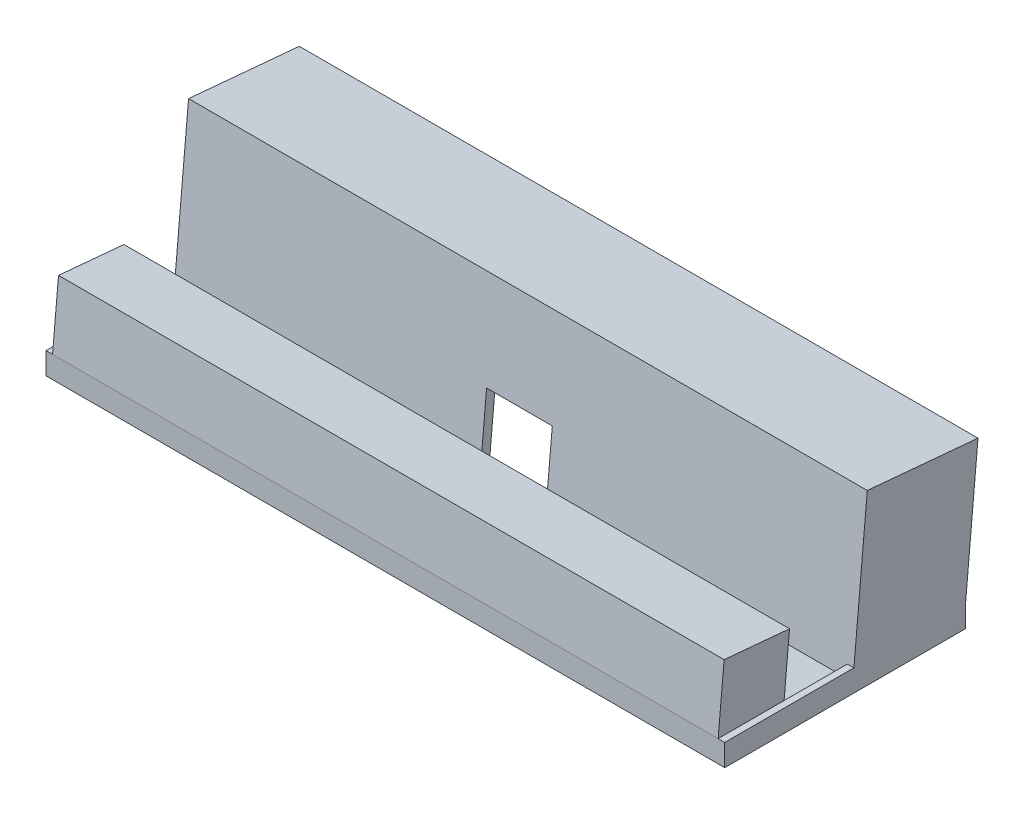
ISO-10303-21;
HEADER;
FILE_DESCRIPTION(('STEP AP214'),'2;1');
FILE_NAME('part.step','',(''),(''),'','','');
FILE_SCHEMA(('AUTOMOTIVE_DESIGN { 1 0 10303 214 1 1 1 1 }'));
ENDSEC;
DATA;
#1=APPLICATION_CONTEXT('core data for automotive mechanical design processes');
#2=APPLICATION_PROTOCOL_DEFINITION('international standard','automotive_design',2000,#1);
#3=PRODUCT_CONTEXT('',#1,'mechanical');
#4=PRODUCT('Part','Part','',(#3));
#5=PRODUCT_RELATED_PRODUCT_CATEGORY('part','',(#4));
#6=PRODUCT_DEFINITION_FORMATION('','',#4);
#7=PRODUCT_DEFINITION_CONTEXT('part definition',#1,'design');
#8=PRODUCT_DEFINITION('design','',#6,#7);
#9=PRODUCT_DEFINITION_SHAPE('','',#8);
#10=(LENGTH_UNIT() NAMED_UNIT(*) SI_UNIT(.MILLI.,.METRE.));
#11=(NAMED_UNIT(*) PLANE_ANGLE_UNIT() SI_UNIT($,.RADIAN.));
#12=(NAMED_UNIT(*) SI_UNIT($,.STERADIAN.) SOLID_ANGLE_UNIT());
#13=UNCERTAINTY_MEASURE_WITH_UNIT(LENGTH_MEASURE(1.E-05),#10,'distance_accuracy_value','');
#14=(GEOMETRIC_REPRESENTATION_CONTEXT(3) GLOBAL_UNCERTAINTY_ASSIGNED_CONTEXT((#13)) GLOBAL_UNIT_ASSIGNED_CONTEXT((#10,
#11,#12)) REPRESENTATION_CONTEXT('',''));
#15=CARTESIAN_POINT('',(0.,0.,0.));
#16=DIRECTION('',(0.,0.,1.));
#17=DIRECTION('',(1.,0.,0.));
#18=AXIS2_PLACEMENT_3D('',#15,#16,#17);
#19=CARTESIAN_POINT('',(0.,5.,0.));
#20=DIRECTION('',(0.,1.,0.));
#21=DIRECTION('',(0.,0.,1.));
#22=AXIS2_PLACEMENT_3D('',#19,#20,#21);
#23=PLANE('',#22);
#24=DIRECTION('',(0.,0.,-1.));
#25=VECTOR('',#24,1.);
#26=CARTESIAN_POINT('',(76.,5.,0.));
#27=LINE('',#26,#25);
#28=CARTESIAN_POINT('',(76.,5.,27.5));
#29=VERTEX_POINT('',#28);
#30=CARTESIAN_POINT('',(76.,5.,12.4381440674719));
#31=VERTEX_POINT('',#30);
#32=EDGE_CURVE('E281',#29,#31,#27,.T.);
#33=ORIENTED_EDGE('',*,*,#32,.F.);
#34=DIRECTION('',(1.,0.,0.));
#35=VECTOR('',#34,1.);
#36=CARTESIAN_POINT('',(-77.5,5.,27.5));
#37=LINE('',#36,#35);
#38=CARTESIAN_POINT('',(77.5,5.,27.5));
#39=VERTEX_POINT('',#38);
#40=EDGE_CURVE('E412',#29,#39,#37,.T.);
#41=ORIENTED_EDGE('',*,*,#40,.T.);
#42=DIRECTION('',(0.,0.,-1.));
#43=VECTOR('',#42,1.);
#44=CARTESIAN_POINT('',(77.5,5.,-27.5));
#45=LINE('',#44,#43);
#46=CARTESIAN_POINT('',(77.5,5.,-2.00396558579183));
#47=VERTEX_POINT('',#46);
#48=EDGE_CURVE('E404',#39,#47,#45,.T.);
#49=ORIENTED_EDGE('',*,*,#48,.T.);
#50=DIRECTION('',(-1.,0.,0.));
#51=VECTOR('',#50,1.);
#52=CARTESIAN_POINT('',(0.,5.,-2.00396558579184));
#53=LINE('',#52,#51);
#54=CARTESIAN_POINT('',(76.,5.,-2.00396558579183));
#55=VERTEX_POINT('',#54);
#56=EDGE_CURVE('E380',#47,#55,#53,.T.);
#57=ORIENTED_EDGE('',*,*,#56,.T.);
#58=DIRECTION('',(0.,0.,1.));
#59=VECTOR('',#58,1.);
#60=CARTESIAN_POINT('',(76.,5.,0.));
#61=LINE('',#60,#59);
#62=EDGE_CURVE('E11',#55,#31,#61,.T.);
#63=ORIENTED_EDGE('',*,*,#62,.T.);
#64=EDGE_LOOP('',(#33,#41,#49,#57,#63));
#65=FACE_BOUND('',#64,.T.);
#66=ADVANCED_FACE('F35',(#65),#23,.T.);
#67=DIRECTION('',(0.,0.,1.));
#68=VECTOR('',#67,1.);
#69=CARTESIAN_POINT('',(-76.,5.,0.));
#70=LINE('',#69,#68);
#71=CARTESIAN_POINT('',(-76.,5.,12.4381440674719));
#72=VERTEX_POINT('',#71);
#73=CARTESIAN_POINT('',(-76.,5.,27.5));
#74=VERTEX_POINT('',#73);
#75=EDGE_CURVE('E276',#72,#74,#70,.T.);
#76=ORIENTED_EDGE('',*,*,#75,.F.);
#77=DIRECTION('',(0.,0.,-1.));
#78=VECTOR('',#77,1.);
#79=CARTESIAN_POINT('',(-76.,5.,0.));
#80=LINE('',#79,#78);
#81=CARTESIAN_POINT('',(-76.,5.,-2.00396558579183));
#82=VERTEX_POINT('',#81);
#83=EDGE_CURVE('E43',#72,#82,#80,.T.);
#84=ORIENTED_EDGE('',*,*,#83,.T.);
#85=CARTESIAN_POINT('',(-77.5,5.,-2.00396558579183));
#86=VERTEX_POINT('',#85);
#87=EDGE_CURVE('E376',#82,#86,#53,.T.);
#88=ORIENTED_EDGE('',*,*,#87,.T.);
#89=DIRECTION('',(0.,0.,1.));
#90=VECTOR('',#89,1.);
#91=CARTESIAN_POINT('',(-77.5,5.,-27.5));
#92=LINE('',#91,#90);
#93=CARTESIAN_POINT('',(-77.5,5.,27.5));
#94=VERTEX_POINT('',#93);
#95=EDGE_CURVE('E410',#86,#94,#92,.T.);
#96=ORIENTED_EDGE('',*,*,#95,.T.);
#97=EDGE_CURVE('E413',#94,#74,#37,.T.);
#98=ORIENTED_EDGE('',*,*,#97,.T.);
#99=EDGE_LOOP('',(#76,#84,#88,#96,#98));
#100=FACE_BOUND('',#99,.T.);
#101=ADVANCED_FACE('F438',(#100),#23,.T.);
#102=CARTESIAN_POINT('',(77.5,5.,-27.5));
#103=DIRECTION('',(-1.,0.,0.));
#104=DIRECTION('',(0.,0.,1.));
#105=AXIS2_PLACEMENT_3D('',#102,#103,#104);
#106=PLANE('',#105);
#107=DIRECTION('',(0.,-1.,0.));
#108=VECTOR('',#107,1.);
#109=CARTESIAN_POINT('',(77.5,5.,-27.5));
#110=LINE('',#109,#108);
#111=CARTESIAN_POINT('',(77.5,5.,-27.5));
#112=VERTEX_POINT('',#111);
#113=CARTESIAN_POINT('',(77.5,0.,-27.5));
#114=VERTEX_POINT('',#113);
#115=EDGE_CURVE('E432',#112,#114,#110,.T.);
#116=ORIENTED_EDGE('',*,*,#115,.F.);
#117=DIRECTION('',(0.,0.995893206467704,-0.0905357460425185));
#118=VECTOR('',#117,1.);
#119=CARTESIAN_POINT('',(77.5,1.39901979719515,-27.1726381633814));
#120=LINE('',#119,#118);
#121=CARTESIAN_POINT('',(77.5,36.2552820235648,-30.3413892748695));
#122=VERTEX_POINT('',#121);
#123=EDGE_CURVE('E361',#112,#122,#120,.T.);
#124=ORIENTED_EDGE('',*,*,#123,.T.);
#125=DIRECTION('',(0.,0.0905357460425186,0.995893206467704));
#126=VECTOR('',#125,1.);
#127=CARTESIAN_POINT('',(77.5,36.2552820235648,-30.3413892748695));
#128=LINE('',#127,#126);
#129=CARTESIAN_POINT('',(77.5,38.5541047986164,-5.05433874930241));
#130=VERTEX_POINT('',#129);
#131=EDGE_CURVE('E367',#122,#130,#128,.T.);
#132=ORIENTED_EDGE('',*,*,#131,.T.);
#133=DIRECTION('',(0.,0.995893206467704,-0.0905357460425185));
#134=VECTOR('',#133,1.);
#135=CARTESIAN_POINT('',(77.5,3.69784257224671,-1.88558763781426));
#136=LINE('',#135,#134);
#137=EDGE_CURVE('E370',#47,#130,#136,.T.);
#138=ORIENTED_EDGE('',*,*,#137,.F.);
#139=ORIENTED_EDGE('',*,*,#48,.F.);
#140=DIRECTION('',(0.,-1.,0.));
#141=VECTOR('',#140,1.);
#142=CARTESIAN_POINT('',(77.5,5.,27.5));
#143=LINE('',#142,#141);
#144=CARTESIAN_POINT('',(77.5,0.,27.5));
#145=VERTEX_POINT('',#144);
#146=EDGE_CURVE('E416',#39,#145,#143,.T.);
#147=ORIENTED_EDGE('',*,*,#146,.T.);
#148=DIRECTION('',(0.,0.,-1.));
#149=VECTOR('',#148,1.);
#150=CARTESIAN_POINT('',(77.5,0.,-27.5));
#151=LINE('',#150,#149);
#152=EDGE_CURVE('E403',#145,#114,#151,.T.);
#153=ORIENTED_EDGE('',*,*,#152,.T.);
#154=EDGE_LOOP('',(#116,#124,#132,#138,#139,#147,#153));
#155=FACE_BOUND('',#154,.T.);
#156=ADVANCED_FACE('F37',(#155),#106,.F.);
#157=CARTESIAN_POINT('',(-77.5,5.,-27.5));
#158=DIRECTION('',(0.,0.,1.));
#159=DIRECTION('',(1.,0.,0.));
#160=AXIS2_PLACEMENT_3D('',#157,#158,#159);
#161=PLANE('',#160);
#162=DIRECTION('',(-1.,0.,0.));
#163=VECTOR('',#162,1.);
#164=CARTESIAN_POINT('',(-77.5,0.,-27.5));
#165=LINE('',#164,#163);
#166=CARTESIAN_POINT('',(-77.5,0.,-27.5));
#167=VERTEX_POINT('',#166);
#168=EDGE_CURVE('E419',#114,#167,#165,.T.);
#169=ORIENTED_EDGE('',*,*,#168,.T.);
#170=DIRECTION('',(0.,-1.,0.));
#171=VECTOR('',#170,1.);
#172=CARTESIAN_POINT('',(-77.5,5.,-27.5));
#173=LINE('',#172,#171);
#174=CARTESIAN_POINT('',(-77.5,5.,-27.5));
#175=VERTEX_POINT('',#174);
#176=EDGE_CURVE('E429',#175,#167,#173,.T.);
#177=ORIENTED_EDGE('',*,*,#176,.F.);
#178=DIRECTION('',(-1.,0.,0.));
#179=VECTOR('',#178,1.);
#180=CARTESIAN_POINT('',(-77.5,5.,-27.5));
#181=LINE('',#180,#179);
#182=EDGE_CURVE('E406',#112,#175,#181,.T.);
#183=ORIENTED_EDGE('',*,*,#182,.F.);
#184=ORIENTED_EDGE('',*,*,#115,.T.);
#185=EDGE_LOOP('',(#169,#177,#183,#184));
#186=FACE_BOUND('',#185,.T.);
#187=ADVANCED_FACE('F500',(#186),#161,.F.);
#188=CARTESIAN_POINT('',(-77.5,5.,-27.5));
#189=DIRECTION('',(1.,0.,0.));
#190=DIRECTION('',(0.,0.,-1.));
#191=AXIS2_PLACEMENT_3D('',#188,#189,#190);
#192=PLANE('',#191);
#193=CARTESIAN_POINT('',(-77.5,25.5,-13.4067773733626));
#194=DIRECTION('',(-1.,0.,0.));
#195=DIRECTION('',(0.,0.,1.));
#196=AXIS2_PLACEMENT_3D('',#193,#194,#195);
#197=CIRCLE('',#196,7.5);
#198=CARTESIAN_POINT('',(-77.5,25.5,-5.90677737336265));
#199=VERTEX_POINT('',#198);
#200=EDGE_CURVE('E858',#199,#199,#197,.T.);
#201=ORIENTED_EDGE('',*,*,#200,.F.);
#202=EDGE_LOOP('',(#201));
#203=FACE_BOUND('',#202,.T.);
#204=ORIENTED_EDGE('',*,*,#95,.F.);
#205=DIRECTION('',(0.,-0.995893206467704,0.0905357460425185));
#206=VECTOR('',#205,1.);
#207=CARTESIAN_POINT('',(-77.5,3.69784257224671,-1.88558763781426));
#208=LINE('',#207,#206);
#209=CARTESIAN_POINT('',(-77.5,38.5541047986164,-5.05433874930241));
#210=VERTEX_POINT('',#209);
#211=EDGE_CURVE('E357',#210,#86,#208,.T.);
#212=ORIENTED_EDGE('',*,*,#211,.F.);
#213=DIRECTION('',(0.,0.0905357460425186,0.995893206467704));
#214=VECTOR('',#213,1.);
#215=CARTESIAN_POINT('',(-77.5,36.2552820235648,-30.3413892748695));
#216=LINE('',#215,#214);
#217=CARTESIAN_POINT('',(-77.5,36.2552820235648,-30.3413892748695));
#218=VERTEX_POINT('',#217);
#219=EDGE_CURVE('E374',#218,#210,#216,.T.);
#220=ORIENTED_EDGE('',*,*,#219,.F.);
#221=DIRECTION('',(0.,-0.995893206467704,0.0905357460425185));
#222=VECTOR('',#221,1.);
#223=CARTESIAN_POINT('',(-77.5,1.39901979719515,-27.1726381633814));
#224=LINE('',#223,#222);
#225=EDGE_CURVE('E358',#218,#175,#224,.T.);
#226=ORIENTED_EDGE('',*,*,#225,.T.);
#227=ORIENTED_EDGE('',*,*,#176,.T.);
#228=DIRECTION('',(0.,0.,1.));
#229=VECTOR('',#228,1.);
#230=CARTESIAN_POINT('',(-77.5,0.,-27.5));
#231=LINE('',#230,#229);
#232=CARTESIAN_POINT('',(-77.5,0.,27.5));
#233=VERTEX_POINT('',#232);
#234=EDGE_CURVE('E421',#167,#233,#231,.T.);
#235=ORIENTED_EDGE('',*,*,#234,.T.);
#236=DIRECTION('',(0.,-1.,0.));
#237=VECTOR('',#236,1.);
#238=CARTESIAN_POINT('',(-77.5,5.,27.5));
#239=LINE('',#238,#237);
#240=EDGE_CURVE('E426',#94,#233,#239,.T.);
#241=ORIENTED_EDGE('',*,*,#240,.F.);
#242=EDGE_LOOP('',(#204,#212,#220,#226,#227,#235,#241));
#243=FACE_BOUND('',#242,.T.);
#244=ADVANCED_FACE('F450',(#203,#243),#192,.F.);
#245=CARTESIAN_POINT('',(-77.5,5.,27.5));
#246=DIRECTION('',(0.,0.,-1.));
#247=DIRECTION('',(-1.,0.,0.));
#248=AXIS2_PLACEMENT_3D('',#245,#246,#247);
#249=PLANE('',#248);
#250=DIRECTION('',(1.,0.,0.));
#251=VECTOR('',#250,1.);
#252=CARTESIAN_POINT('',(-77.5,0.,27.5));
#253=LINE('',#252,#251);
#254=EDGE_CURVE('E407',#233,#145,#253,.T.);
#255=ORIENTED_EDGE('',*,*,#254,.T.);
#256=ORIENTED_EDGE('',*,*,#146,.F.);
#257=ORIENTED_EDGE('',*,*,#40,.F.);
#258=DIRECTION('',(-1.,0.,0.));
#259=VECTOR('',#258,1.);
#260=CARTESIAN_POINT('',(76.,5.,27.5));
#261=LINE('',#260,#259);
#262=EDGE_CURVE('E258',#29,#74,#261,.T.);
#263=ORIENTED_EDGE('',*,*,#262,.T.);
#264=ORIENTED_EDGE('',*,*,#97,.F.);
#265=ORIENTED_EDGE('',*,*,#240,.T.);
#266=EDGE_LOOP('',(#255,#256,#257,#263,#264,#265));
#267=FACE_BOUND('',#266,.T.);
#268=ADVANCED_FACE('F499',(#267),#249,.F.);
#269=CARTESIAN_POINT('',(0.,0.,0.));
#270=DIRECTION('',(0.,1.,0.));
#271=DIRECTION('',(0.,0.,1.));
#272=AXIS2_PLACEMENT_3D('',#269,#270,#271);
#273=PLANE('',#272);
#274=DIRECTION('',(1.,0.,0.));
#275=VECTOR('',#274,1.);
#276=CARTESIAN_POINT('',(-77.5,0.,25.5));
#277=LINE('',#276,#275);
#278=CARTESIAN_POINT('',(-75.5,0.,25.5));
#279=VERTEX_POINT('',#278);
#280=CARTESIAN_POINT('',(75.5,0.,25.5));
#281=VERTEX_POINT('',#280);
#282=EDGE_CURVE('E289',#279,#281,#277,.T.);
#283=ORIENTED_EDGE('',*,*,#282,.T.);
#284=DIRECTION('',(0.,0.,-1.));
#285=VECTOR('',#284,1.);
#286=CARTESIAN_POINT('',(75.5,0.,-27.5));
#287=LINE('',#286,#285);
#288=CARTESIAN_POINT('',(75.5,0.,-25.5));
#289=VERTEX_POINT('',#288);
#290=EDGE_CURVE('E335',#281,#289,#287,.T.);
#291=ORIENTED_EDGE('',*,*,#290,.T.);
#292=DIRECTION('',(-1.,0.,0.));
#293=VECTOR('',#292,1.);
#294=CARTESIAN_POINT('',(-77.5,0.,-25.5));
#295=LINE('',#294,#293);
#296=CARTESIAN_POINT('',(-75.5,0.,-25.5));
#297=VERTEX_POINT('',#296);
#298=EDGE_CURVE('E340',#289,#297,#295,.T.);
#299=ORIENTED_EDGE('',*,*,#298,.T.);
#300=DIRECTION('',(0.,0.,1.));
#301=VECTOR('',#300,1.);
#302=CARTESIAN_POINT('',(-75.5,0.,-27.5));
#303=LINE('',#302,#301);
#304=EDGE_CURVE('E343',#297,#279,#303,.T.);
#305=ORIENTED_EDGE('',*,*,#304,.T.);
#306=EDGE_LOOP('',(#283,#291,#299,#305));
#307=FACE_BOUND('',#306,.T.);
#308=ORIENTED_EDGE('',*,*,#152,.F.);
#309=ORIENTED_EDGE('',*,*,#254,.F.);
#310=ORIENTED_EDGE('',*,*,#234,.F.);
#311=ORIENTED_EDGE('',*,*,#168,.F.);
#312=EDGE_LOOP('',(#308,#309,#310,#311));
#313=FACE_BOUND('',#312,.T.);
#314=ADVANCED_FACE('F497',(#307,#313),#273,.F.);
#315=CARTESIAN_POINT('',(76.,8.62142984170074,12.1089231727719));
#316=DIRECTION('',(-1.,0.,0.));
#317=DIRECTION('',(0.,0.,1.));
#318=AXIS2_PLACEMENT_3D('',#315,#316,#317);
#319=PLANE('',#318);
#320=DIRECTION('',(0.,-0.995893206467704,0.0905357460425185));
#321=VECTOR('',#320,1.);
#322=CARTESIAN_POINT('',(76.,7.31927241394745,-2.21480853251433));
#323=LINE('',#322,#321);
#324=CARTESIAN_POINT('',(76.,2.33980638160893,-1.76212980230174));
#325=VERTEX_POINT('',#324);
#326=EDGE_CURVE('E401',#55,#325,#323,.T.);
#327=ORIENTED_EDGE('',*,*,#326,.T.);
#328=DIRECTION('',(0.,-0.0905357460425185,-0.995893206467704));
#329=VECTOR('',#328,1.);
#330=CARTESIAN_POINT('',(76.,3.64196380936222,12.5616019029845));
#331=LINE('',#330,#329);
#332=CARTESIAN_POINT('',(76.,3.64196380936222,12.5616019029845));
#333=VERTEX_POINT('',#332);
#334=EDGE_CURVE('E381',#333,#325,#331,.T.);
#335=ORIENTED_EDGE('',*,*,#334,.F.);
#336=DIRECTION('',(0.,-0.995893206467704,0.0905357460425185));
#337=VECTOR('',#336,1.);
#338=CARTESIAN_POINT('',(76.,8.62142984170074,12.1089231727719));
#339=LINE('',#338,#337);
#340=EDGE_CURVE('E394',#31,#333,#339,.T.);
#341=ORIENTED_EDGE('',*,*,#340,.F.);
#342=ORIENTED_EDGE('',*,*,#62,.F.);
#343=EDGE_LOOP('',(#327,#335,#341,#342));
#344=FACE_BOUND('',#343,.T.);
#345=ADVANCED_FACE('F477',(#344),#319,.T.);
#346=CARTESIAN_POINT('',(-76.,7.31927241394745,-2.21480853251433));
#347=DIRECTION('',(0.,0.0905357460425185,0.995893206467704));
#348=DIRECTION('',(0.,-0.995893206467704,0.0905357460425185));
#349=AXIS2_PLACEMENT_3D('',#346,#347,#348);
#350=PLANE('',#349);
#351=DIRECTION('',(0.,0.995893206467704,-0.0905357460425185));
#352=VECTOR('',#351,1.);
#353=CARTESIAN_POINT('',(7.5,17.2782044786245,-3.12016599293952));
#354=LINE('',#353,#352);
#355=CARTESIAN_POINT('',(7.5,2.33980638160893,-1.76212980230174));
#356=VERTEX_POINT('',#355);
#357=CARTESIAN_POINT('',(7.5,17.2782044786245,-3.12016599293952));
#358=VERTEX_POINT('',#357);
#359=EDGE_CURVE('E223',#356,#358,#354,.T.);
#360=ORIENTED_EDGE('',*,*,#359,.F.);
#361=DIRECTION('',(-1.,0.,0.));
#362=VECTOR('',#361,1.);
#363=CARTESIAN_POINT('',(-76.,2.33980638160893,-1.76212980230174));
#364=LINE('',#363,#362);
#365=EDGE_CURVE('E385',#325,#356,#364,.T.);
#366=ORIENTED_EDGE('',*,*,#365,.F.);
#367=ORIENTED_EDGE('',*,*,#326,.F.);
#368=ORIENTED_EDGE('',*,*,#56,.F.);
#369=ORIENTED_EDGE('',*,*,#137,.T.);
#370=DIRECTION('',(-1.,0.,0.));
#371=VECTOR('',#370,1.);
#372=CARTESIAN_POINT('',(-77.5,38.5541047986164,-5.05433874930241));
#373=LINE('',#372,#371);
#374=EDGE_CURVE('E362',#130,#210,#373,.T.);
#375=ORIENTED_EDGE('',*,*,#374,.T.);
#376=ORIENTED_EDGE('',*,*,#211,.T.);
#377=ORIENTED_EDGE('',*,*,#87,.F.);
#378=DIRECTION('',(0.,-0.995893206467704,0.0905357460425185));
#379=VECTOR('',#378,1.);
#380=CARTESIAN_POINT('',(-76.,7.31927241394745,-2.21480853251433));
#381=LINE('',#380,#379);
#382=CARTESIAN_POINT('',(-76.,2.33980638160893,-1.76212980230174));
#383=VERTEX_POINT('',#382);
#384=EDGE_CURVE('E398',#82,#383,#381,.T.);
#385=ORIENTED_EDGE('',*,*,#384,.T.);
#386=CARTESIAN_POINT('',(-7.49999999999999,2.33980638160893,-1.76212980230174));
#387=VERTEX_POINT('',#386);
#388=EDGE_CURVE('E384',#387,#383,#364,.T.);
#389=ORIENTED_EDGE('',*,*,#388,.F.);
#390=DIRECTION('',(0.,-0.995893206467704,0.0905357460425185));
#391=VECTOR('',#390,1.);
#392=CARTESIAN_POINT('',(-7.5,17.2782044786245,-3.12016599293952));
#393=LINE('',#392,#391);
#394=CARTESIAN_POINT('',(-7.5,17.2782044786245,-3.12016599293952));
#395=VERTEX_POINT('',#394);
#396=EDGE_CURVE('E55',#395,#387,#393,.T.);
#397=ORIENTED_EDGE('',*,*,#396,.F.);
#398=DIRECTION('',(-1.,0.,0.));
#399=VECTOR('',#398,1.);
#400=CARTESIAN_POINT('',(-7.5,17.2782044786245,-3.12016599293952));
#401=LINE('',#400,#399);
#402=EDGE_CURVE('E243',#358,#395,#401,.T.);
#403=ORIENTED_EDGE('',*,*,#402,.F.);
#404=EDGE_LOOP('',(#360,#366,#367,#368,#369,#375,#376,#377,#385,#389,#397,#403));
#405=FACE_BOUND('',#404,.T.);
#406=ADVANCED_FACE('F444',(#405),#350,.T.);
#407=CARTESIAN_POINT('',(-76.,8.62142984170074,12.1089231727719));
#408=DIRECTION('',(1.,0.,0.));
#409=DIRECTION('',(0.,0.,-1.));
#410=AXIS2_PLACEMENT_3D('',#407,#408,#409);
#411=PLANE('',#410);
#412=DIRECTION('',(0.,-0.995893206467704,0.0905357460425185));
#413=VECTOR('',#412,1.);
#414=CARTESIAN_POINT('',(-76.,8.62142984170074,12.1089231727719));
#415=LINE('',#414,#413);
#416=CARTESIAN_POINT('',(-76.,3.64196380936222,12.5616019029845));
#417=VERTEX_POINT('',#416);
#418=EDGE_CURVE('E396',#72,#417,#415,.T.);
#419=ORIENTED_EDGE('',*,*,#418,.T.);
#420=DIRECTION('',(0.,0.0905357460425185,0.995893206467704));
#421=VECTOR('',#420,1.);
#422=CARTESIAN_POINT('',(-76.,3.64196380936222,12.5616019029845));
#423=LINE('',#422,#421);
#424=EDGE_CURVE('E388',#383,#417,#423,.T.);
#425=ORIENTED_EDGE('',*,*,#424,.F.);
#426=ORIENTED_EDGE('',*,*,#384,.F.);
#427=ORIENTED_EDGE('',*,*,#83,.F.);
#428=EDGE_LOOP('',(#419,#425,#426,#427));
#429=FACE_BOUND('',#428,.T.);
#430=ADVANCED_FACE('F470',(#429),#411,.T.);
#431=CARTESIAN_POINT('',(-76.,8.62142984170074,12.1089231727719));
#432=DIRECTION('',(0.,-0.0905357460425185,-0.995893206467704));
#433=DIRECTION('',(0.,0.995893206467704,-0.0905357460425185));
#434=AXIS2_PLACEMENT_3D('',#431,#432,#433);
#435=PLANE('',#434);
#436=ORIENTED_EDGE('',*,*,#340,.T.);
#437=DIRECTION('',(1.,0.,0.));
#438=VECTOR('',#437,1.);
#439=CARTESIAN_POINT('',(-76.,3.64196380936222,12.5616019029845));
#440=LINE('',#439,#438);
#441=EDGE_CURVE('E391',#417,#333,#440,.T.);
#442=ORIENTED_EDGE('',*,*,#441,.F.);
#443=ORIENTED_EDGE('',*,*,#418,.F.);
#444=DIRECTION('',(0.,0.995893206467704,-0.0905357460425185));
#445=VECTOR('',#444,1.);
#446=CARTESIAN_POINT('',(-76.,3.64196380936222,12.5616019029845));
#447=LINE('',#446,#445);
#448=CARTESIAN_POINT('',(-76.,18.5803619063778,11.2035657123467));
#449=VERTEX_POINT('',#448);
#450=EDGE_CURVE('E270',#72,#449,#447,.T.);
#451=ORIENTED_EDGE('',*,*,#450,.T.);
#452=DIRECTION('',(1.,0.,0.));
#453=VECTOR('',#452,1.);
#454=CARTESIAN_POINT('',(76.,18.5803619063778,11.2035657123467));
#455=LINE('',#454,#453);
#456=CARTESIAN_POINT('',(76.,18.5803619063778,11.2035657123467));
#457=VERTEX_POINT('',#456);
#458=EDGE_CURVE('E259',#449,#457,#455,.T.);
#459=ORIENTED_EDGE('',*,*,#458,.T.);
#460=DIRECTION('',(0.,-0.995893206467704,0.0905357460425185));
#461=VECTOR('',#460,1.);
#462=CARTESIAN_POINT('',(76.,3.64196380936222,12.5616019029845));
#463=LINE('',#462,#461);
#464=EDGE_CURVE('E235',#457,#31,#463,.T.);
#465=ORIENTED_EDGE('',*,*,#464,.T.);
#466=EDGE_LOOP('',(#436,#442,#443,#451,#459,#465));
#467=FACE_BOUND('',#466,.T.);
#468=ADVANCED_FACE('F468',(#467),#435,.T.);
#469=CARTESIAN_POINT('',(0.,2.47950819672131,-0.225409836065574));
#470=DIRECTION('',(0.,-0.995893206467704,0.0905357460425185));
#471=DIRECTION('',(0.,-0.0905357460425185,-0.995893206467704));
#472=AXIS2_PLACEMENT_3D('',#469,#470,#471);
#473=PLANE('',#472);
#474=ORIENTED_EDGE('',*,*,#334,.T.);
#475=ORIENTED_EDGE('',*,*,#365,.T.);
#476=DIRECTION('',(0.,0.0905357460425185,0.995893206467704));
#477=VECTOR('',#476,1.);
#478=CARTESIAN_POINT('',(7.5,-0.256289196914466,-30.3191811660591));
#479=LINE('',#478,#477);
#480=CARTESIAN_POINT('',(7.5,2.1587348895239,-3.75391621523713));
#481=VERTEX_POINT('',#480);
#482=EDGE_CURVE('E236',#481,#356,#479,.T.);
#483=ORIENTED_EDGE('',*,*,#482,.F.);
#484=DIRECTION('',(-1.,0.,0.));
#485=VECTOR('',#484,1.);
#486=CARTESIAN_POINT('',(-7.5,2.15873488952389,-3.75391621523714));
#487=LINE('',#486,#485);
#488=CARTESIAN_POINT('',(-7.5,2.15873488952389,-3.75391621523714));
#489=VERTEX_POINT('',#488);
#490=EDGE_CURVE('E241',#481,#489,#487,.T.);
#491=ORIENTED_EDGE('',*,*,#490,.T.);
#492=DIRECTION('',(0.,0.0905357460425185,0.995893206467704));
#493=VECTOR('',#492,1.);
#494=CARTESIAN_POINT('',(-7.5,-0.25628919691447,-30.3191811660591));
#495=LINE('',#494,#493);
#496=EDGE_CURVE('E252',#489,#387,#495,.T.);
#497=ORIENTED_EDGE('',*,*,#496,.T.);
#498=ORIENTED_EDGE('',*,*,#388,.T.);
#499=ORIENTED_EDGE('',*,*,#424,.T.);
#500=ORIENTED_EDGE('',*,*,#441,.T.);
#501=EDGE_LOOP('',(#474,#475,#483,#491,#497,#498,#499,#500));
#502=FACE_BOUND('',#501,.T.);
#503=ADVANCED_FACE('F472',(#502),#473,.F.);
#504=CARTESIAN_POINT('',(0.,-2.43852459016394,-26.8237704918033));
#505=DIRECTION('',(0.,-0.0905357460425185,-0.995893206467704));
#506=DIRECTION('',(0.,0.995893206467704,-0.0905357460425185));
#507=AXIS2_PLACEMENT_3D('',#504,#505,#506);
#508=PLANE('',#507);
#509=ORIENTED_EDGE('',*,*,#182,.T.);
#510=ORIENTED_EDGE('',*,*,#225,.F.);
#511=DIRECTION('',(-1.,0.,0.));
#512=VECTOR('',#511,1.);
#513=CARTESIAN_POINT('',(-77.5,36.2552820235648,-30.3413892748695));
#514=LINE('',#513,#512);
#515=EDGE_CURVE('E364',#122,#218,#514,.T.);
#516=ORIENTED_EDGE('',*,*,#515,.F.);
#517=ORIENTED_EDGE('',*,*,#123,.F.);
#518=EDGE_LOOP('',(#509,#510,#516,#517));
#519=FACE_BOUND('',#518,.T.);
#520=ADVANCED_FACE('F491',(#519),#508,.T.);
#521=CARTESIAN_POINT('',(-77.5,36.2552820235648,-30.3413892748695));
#522=DIRECTION('',(0.,0.995893206467704,-0.0905357460425186));
#523=DIRECTION('',(0.,0.0905357460425186,0.995893206467704));
#524=AXIS2_PLACEMENT_3D('',#521,#522,#523);
#525=PLANE('',#524);
#526=ORIENTED_EDGE('',*,*,#374,.F.);
#527=ORIENTED_EDGE('',*,*,#131,.F.);
#528=ORIENTED_EDGE('',*,*,#515,.T.);
#529=ORIENTED_EDGE('',*,*,#219,.T.);
#530=EDGE_LOOP('',(#526,#527,#528,#529));
#531=FACE_BOUND('',#530,.T.);
#532=ADVANCED_FACE('F489',(#531),#525,.T.);
#533=CARTESIAN_POINT('',(0.,0.487721783785904,-0.0443383439805367));
#534=DIRECTION('',(0.,-0.995893206467704,0.0905357460425185));
#535=DIRECTION('',(0.,-0.0905357460425185,-0.995893206467704));
#536=AXIS2_PLACEMENT_3D('',#533,#534,#535);
#537=PLANE('',#536);
#538=DIRECTION('',(0.,-0.0905357460425185,-0.995893206467704));
#539=VECTOR('',#538,1.);
#540=CARTESIAN_POINT('',(-75.5,-1.95080280637803,-26.8681088357838));
#541=LINE('',#540,#539);
#542=CARTESIAN_POINT('',(-75.5,1.83124888851185,14.7344598080049));
#543=VERTEX_POINT('',#542);
#544=CARTESIAN_POINT('',(-75.5,0.166948476588488,-3.57284472315211));
#545=VERTEX_POINT('',#544);
#546=EDGE_CURVE('E354',#543,#545,#541,.T.);
#547=ORIENTED_EDGE('',*,*,#546,.T.);
#548=DIRECTION('',(-1.,0.,0.));
#549=VECTOR('',#548,1.);
#550=CARTESIAN_POINT('',(0.,0.166948476588488,-3.57284472315211));
#551=LINE('',#550,#549);
#552=CARTESIAN_POINT('',(75.5,0.166948476588488,-3.57284472315211));
#553=VERTEX_POINT('',#552);
#554=EDGE_CURVE('E324',#553,#545,#551,.T.);
#555=ORIENTED_EDGE('',*,*,#554,.F.);
#556=DIRECTION('',(0.,0.0905357460425185,0.995893206467704));
#557=VECTOR('',#556,1.);
#558=CARTESIAN_POINT('',(75.5,-1.95080280637803,-26.8681088357838));
#559=LINE('',#558,#557);
#560=CARTESIAN_POINT('',(75.5,1.83124888851185,14.7344598080049));
#561=VERTEX_POINT('',#560);
#562=EDGE_CURVE('E351',#553,#561,#559,.T.);
#563=ORIENTED_EDGE('',*,*,#562,.T.);
#564=DIRECTION('',(1.,0.,0.));
#565=VECTOR('',#564,1.);
#566=CARTESIAN_POINT('',(0.,1.83124888851185,14.7344598080049));
#567=LINE('',#566,#565);
#568=EDGE_CURVE('E330',#543,#561,#567,.T.);
#569=ORIENTED_EDGE('',*,*,#568,.F.);
#570=EDGE_LOOP('',(#547,#555,#563,#569));
#571=FACE_BOUND('',#570,.T.);
#572=ADVANCED_FACE('F576',(#571),#537,.T.);
#573=CARTESIAN_POINT('',(0.,3.,0.));
#574=DIRECTION('',(0.,1.,0.));
#575=DIRECTION('',(0.,0.,1.));
#576=AXIS2_PLACEMENT_3D('',#573,#574,#575);
#577=PLANE('',#576);
#578=DIRECTION('',(0.,0.,-1.));
#579=VECTOR('',#578,1.);
#580=CARTESIAN_POINT('',(75.5,3.,-27.5));
#581=LINE('',#580,#579);
#582=CARTESIAN_POINT('',(75.5,3.,25.5));
#583=VERTEX_POINT('',#582);
#584=CARTESIAN_POINT('',(75.5,3.,14.6282097069605));
#585=VERTEX_POINT('',#584);
#586=EDGE_CURVE('E285',#583,#585,#581,.T.);
#587=ORIENTED_EDGE('',*,*,#586,.F.);
#588=DIRECTION('',(1.,0.,0.));
#589=VECTOR('',#588,1.);
#590=CARTESIAN_POINT('',(-77.5,3.,25.5));
#591=LINE('',#590,#589);
#592=CARTESIAN_POINT('',(-75.5,3.,25.5));
#593=VERTEX_POINT('',#592);
#594=EDGE_CURVE('E297',#593,#583,#591,.T.);
#595=ORIENTED_EDGE('',*,*,#594,.F.);
#596=DIRECTION('',(0.,0.,1.));
#597=VECTOR('',#596,1.);
#598=CARTESIAN_POINT('',(-75.5,3.,-27.5));
#599=LINE('',#598,#597);
#600=CARTESIAN_POINT('',(-75.5,3.,14.6282097069605));
#601=VERTEX_POINT('',#600);
#602=EDGE_CURVE('E295',#601,#593,#599,.T.);
#603=ORIENTED_EDGE('',*,*,#602,.F.);
#604=DIRECTION('',(-1.,0.,0.));
#605=VECTOR('',#604,1.);
#606=CARTESIAN_POINT('',(0.,3.,14.6282097069605));
#607=LINE('',#606,#605);
#608=EDGE_CURVE('E290',#585,#601,#607,.T.);
#609=ORIENTED_EDGE('',*,*,#608,.F.);
#610=EDGE_LOOP('',(#587,#595,#603,#609));
#611=FACE_BOUND('',#610,.T.);
#612=ADVANCED_FACE('F583',(#611),#577,.F.);
#613=CARTESIAN_POINT('',(75.5,5.,-27.5));
#614=DIRECTION('',(-1.,0.,0.));
#615=DIRECTION('',(0.,0.,1.));
#616=AXIS2_PLACEMENT_3D('',#613,#614,#615);
#617=PLANE('',#616);
#618=DIRECTION('',(0.,0.995893206467704,-0.0905357460425185));
#619=VECTOR('',#618,1.);
#620=CARTESIAN_POINT('',(75.5,7.11775128296652,-4.20473588736829));
#621=LINE('',#620,#619);
#622=CARTESIAN_POINT('',(75.5,36.3812468935959,-6.86505367015278));
#623=VERTEX_POINT('',#622);
#624=EDGE_CURVE('E311',#553,#623,#621,.T.);
#625=ORIENTED_EDGE('',*,*,#624,.T.);
#626=DIRECTION('',(0.,0.0905357460425186,0.995893206467704));
#627=VECTOR('',#626,1.);
#628=CARTESIAN_POINT('',(75.5,34.2634956106294,-30.1603177827845));
#629=LINE('',#628,#627);
#630=CARTESIAN_POINT('',(75.5,34.4445671027144,-28.1685313698491));
#631=VERTEX_POINT('',#630);
#632=EDGE_CURVE('E307',#631,#623,#629,.T.);
#633=ORIENTED_EDGE('',*,*,#632,.F.);
#634=DIRECTION('',(0.,0.995893206467704,-0.0905357460425185));
#635=VECTOR('',#634,1.);
#636=CARTESIAN_POINT('',(75.5,-2.2574530980789,-24.8319840788679));
#637=LINE('',#636,#635);
#638=CARTESIAN_POINT('',(75.5,5.09072203437442,-25.5));
#639=VERTEX_POINT('',#638);
#640=EDGE_CURVE('E303',#639,#631,#637,.T.);
#641=ORIENTED_EDGE('',*,*,#640,.F.);
#642=DIRECTION('',(0.,-1.,0.));
#643=VECTOR('',#642,1.);
#644=CARTESIAN_POINT('',(75.5,5.,-25.5));
#645=LINE('',#644,#643);
#646=EDGE_CURVE('E294',#639,#289,#645,.T.);
#647=ORIENTED_EDGE('',*,*,#646,.T.);
#648=ORIENTED_EDGE('',*,*,#290,.F.);
#649=DIRECTION('',(0.,-1.,0.));
#650=VECTOR('',#649,1.);
#651=CARTESIAN_POINT('',(75.5,5.,25.5));
#652=LINE('',#651,#650);
#653=EDGE_CURVE('E299',#583,#281,#652,.T.);
#654=ORIENTED_EDGE('',*,*,#653,.F.);
#655=ORIENTED_EDGE('',*,*,#586,.T.);
#656=DIRECTION('',(0.,0.995893206467704,-0.0905357460425185));
#657=VECTOR('',#656,1.);
#658=CARTESIAN_POINT('',(75.5,8.80250133378578,14.1007095857073));
#659=LINE('',#658,#657);
#660=EDGE_CURVE('E293',#561,#585,#659,.T.);
#661=ORIENTED_EDGE('',*,*,#660,.F.);
#662=ORIENTED_EDGE('',*,*,#562,.F.);
#663=EDGE_LOOP('',(#625,#633,#641,#647,#648,#654,#655,#661,#662));
#664=FACE_BOUND('',#663,.T.);
#665=ADVANCED_FACE('F592',(#664),#617,.T.);
#666=CARTESIAN_POINT('',(-77.5,5.,-25.5));
#667=DIRECTION('',(0.,0.,1.));
#668=DIRECTION('',(1.,0.,0.));
#669=AXIS2_PLACEMENT_3D('',#666,#667,#668);
#670=PLANE('',#669);
#671=ORIENTED_EDGE('',*,*,#298,.F.);
#672=ORIENTED_EDGE('',*,*,#646,.F.);
#673=DIRECTION('',(-1.,0.,0.));
#674=VECTOR('',#673,1.);
#675=CARTESIAN_POINT('',(0.,5.09072203437442,-25.5));
#676=LINE('',#675,#674);
#677=CARTESIAN_POINT('',(-75.5,5.09072203437442,-25.5));
#678=VERTEX_POINT('',#677);
#679=EDGE_CURVE('E288',#639,#678,#676,.T.);
#680=ORIENTED_EDGE('',*,*,#679,.T.);
#681=DIRECTION('',(0.,-1.,0.));
#682=VECTOR('',#681,1.);
#683=CARTESIAN_POINT('',(-75.5,5.,-25.5));
#684=LINE('',#683,#682);
#685=EDGE_CURVE('E302',#678,#297,#684,.T.);
#686=ORIENTED_EDGE('',*,*,#685,.T.);
#687=EDGE_LOOP('',(#671,#672,#680,#686));
#688=FACE_BOUND('',#687,.T.);
#689=ADVANCED_FACE('F600',(#688),#670,.T.);
#690=CARTESIAN_POINT('',(-75.5,5.,-27.5));
#691=DIRECTION('',(1.,0.,0.));
#692=DIRECTION('',(0.,0.,-1.));
#693=AXIS2_PLACEMENT_3D('',#690,#691,#692);
#694=PLANE('',#693);
#695=DIRECTION('',(0.,-0.995893206467704,0.0905357460425185));
#696=VECTOR('',#695,1.);
#697=CARTESIAN_POINT('',(-75.5,7.11775128296652,-4.20473588736829));
#698=LINE('',#697,#696);
#699=CARTESIAN_POINT('',(-75.5,36.3812468935959,-6.86505367015278));
#700=VERTEX_POINT('',#699);
#701=CARTESIAN_POINT('',(-75.5,26.1790180953189,-5.93757832485487));
#702=VERTEX_POINT('',#701);
#703=EDGE_CURVE('E314',#700,#702,#698,.T.);
#704=ORIENTED_EDGE('',*,*,#703,.T.);
#705=CARTESIAN_POINT('',(-75.5,25.5,-13.4067773733626));
#706=DIRECTION('',(1.,0.,0.));
#707=DIRECTION('',(0.,0.,-1.));
#708=AXIS2_PLACEMENT_3D('',#705,#706,#707);
#709=CIRCLE('',#708,7.5);
#710=EDGE_CURVE('E48',#702,#702,#709,.F.);
#711=ORIENTED_EDGE('',*,*,#710,.T.);
#712=EDGE_CURVE('E284',#702,#545,#698,.T.);
#713=ORIENTED_EDGE('',*,*,#712,.T.);
#714=ORIENTED_EDGE('',*,*,#546,.F.);
#715=DIRECTION('',(0.,0.995893206467704,-0.0905357460425185));
#716=VECTOR('',#715,1.);
#717=CARTESIAN_POINT('',(-75.5,8.78205169488988,14.1025686437887));
#718=LINE('',#717,#716);
#719=EDGE_CURVE('E349',#543,#601,#718,.T.);
#720=ORIENTED_EDGE('',*,*,#719,.T.);
#721=ORIENTED_EDGE('',*,*,#602,.T.);
#722=DIRECTION('',(0.,-1.,0.));
#723=VECTOR('',#722,1.);
#724=CARTESIAN_POINT('',(-75.5,5.,25.5));
#725=LINE('',#724,#723);
#726=EDGE_CURVE('E316',#593,#279,#725,.T.);
#727=ORIENTED_EDGE('',*,*,#726,.T.);
#728=ORIENTED_EDGE('',*,*,#304,.F.);
#729=ORIENTED_EDGE('',*,*,#685,.F.);
#730=DIRECTION('',(0.,-0.995893206467704,0.0905357460425185));
#731=VECTOR('',#730,1.);
#732=CARTESIAN_POINT('',(-75.5,-2.2574530980789,-24.8319840788679));
#733=LINE('',#732,#731);
#734=CARTESIAN_POINT('',(-75.5,34.4445671027144,-28.1685313698491));
#735=VERTEX_POINT('',#734);
#736=EDGE_CURVE('E306',#735,#678,#733,.T.);
#737=ORIENTED_EDGE('',*,*,#736,.F.);
#738=DIRECTION('',(0.,0.0905357460425186,0.995893206467704));
#739=VECTOR('',#738,1.);
#740=CARTESIAN_POINT('',(-75.5,34.2634956106294,-30.1603177827845));
#741=LINE('',#740,#739);
#742=EDGE_CURVE('E310',#735,#700,#741,.T.);
#743=ORIENTED_EDGE('',*,*,#742,.T.);
#744=EDGE_LOOP('',(#704,#711,#713,#714,#720,#721,#727,#728,#729,#737,#743));
#745=FACE_BOUND('',#744,.T.);
#746=ADVANCED_FACE('F609',(#745),#694,.T.);
#747=CARTESIAN_POINT('',(-77.5,5.,25.5));
#748=DIRECTION('',(0.,0.,-1.));
#749=DIRECTION('',(-1.,0.,0.));
#750=AXIS2_PLACEMENT_3D('',#747,#748,#749);
#751=PLANE('',#750);
#752=ORIENTED_EDGE('',*,*,#282,.F.);
#753=ORIENTED_EDGE('',*,*,#726,.F.);
#754=ORIENTED_EDGE('',*,*,#594,.T.);
#755=ORIENTED_EDGE('',*,*,#653,.T.);
#756=EDGE_LOOP('',(#752,#753,#754,#755));
#757=FACE_BOUND('',#756,.T.);
#758=ADVANCED_FACE('F617',(#757),#751,.T.);
#759=CARTESIAN_POINT('',(-76.,7.13820092186242,-4.20659494544974));
#760=DIRECTION('',(0.,0.0905357460425185,0.995893206467704));
#761=DIRECTION('',(0.,-0.995893206467704,0.0905357460425185));
#762=AXIS2_PLACEMENT_3D('',#759,#760,#761);
#763=PLANE('',#762);
#764=ORIENTED_EDGE('',*,*,#490,.F.);
#765=DIRECTION('',(0.,-0.995893206467704,0.0905357460425185));
#766=VECTOR('',#765,1.);
#767=CARTESIAN_POINT('',(7.5,17.0971329865395,-5.11195240587492));
#768=LINE('',#767,#766);
#769=CARTESIAN_POINT('',(7.5,17.0971329865395,-5.11195240587492));
#770=VERTEX_POINT('',#769);
#771=EDGE_CURVE('E220',#770,#481,#768,.T.);
#772=ORIENTED_EDGE('',*,*,#771,.F.);
#773=DIRECTION('',(1.,0.,0.));
#774=VECTOR('',#773,1.);
#775=CARTESIAN_POINT('',(-7.5,17.0971329865395,-5.11195240587492));
#776=LINE('',#775,#774);
#777=CARTESIAN_POINT('',(-7.49999999999999,17.0971329865395,-5.11195240587492));
#778=VERTEX_POINT('',#777);
#779=EDGE_CURVE('E231',#778,#770,#776,.T.);
#780=ORIENTED_EDGE('',*,*,#779,.F.);
#781=DIRECTION('',(0.,0.995893206467704,-0.0905357460425185));
#782=VECTOR('',#781,1.);
#783=CARTESIAN_POINT('',(-7.5,17.0971329865395,-5.11195240587492));
#784=LINE('',#783,#782);
#785=EDGE_CURVE('E245',#489,#778,#784,.T.);
#786=ORIENTED_EDGE('',*,*,#785,.F.);
#787=EDGE_LOOP('',(#764,#772,#780,#786));
#788=FACE_BOUND('',#787,.T.);
#789=ORIENTED_EDGE('',*,*,#703,.F.);
#790=DIRECTION('',(-1.,0.,0.));
#791=VECTOR('',#790,1.);
#792=CARTESIAN_POINT('',(-76.,36.3812468935959,-6.86505367015278));
#793=LINE('',#792,#791);
#794=EDGE_CURVE('E313',#623,#700,#793,.T.);
#795=ORIENTED_EDGE('',*,*,#794,.F.);
#796=ORIENTED_EDGE('',*,*,#624,.F.);
#797=ORIENTED_EDGE('',*,*,#554,.T.);
#798=ORIENTED_EDGE('',*,*,#712,.F.);
#799=EDGE_LOOP('',(#789,#795,#796,#797,#798));
#800=FACE_BOUND('',#799,.T.);
#801=ADVANCED_FACE('F238',(#788,#800),#763,.F.);
#802=CARTESIAN_POINT('',(-76.,8.80250133378578,14.1007095857073));
#803=DIRECTION('',(0.,-0.0905357460425185,-0.995893206467704));
#804=DIRECTION('',(0.,0.995893206467704,-0.0905357460425185));
#805=AXIS2_PLACEMENT_3D('',#802,#803,#804);
#806=PLANE('',#805);
#807=ORIENTED_EDGE('',*,*,#568,.T.);
#808=ORIENTED_EDGE('',*,*,#660,.T.);
#809=ORIENTED_EDGE('',*,*,#608,.T.);
#810=ORIENTED_EDGE('',*,*,#719,.F.);
#811=EDGE_LOOP('',(#807,#808,#809,#810));
#812=FACE_BOUND('',#811,.T.);
#813=ADVANCED_FACE('F631',(#812),#806,.F.);
#814=CARTESIAN_POINT('',(0.,-2.2574530980789,-24.8319840788679));
#815=DIRECTION('',(0.,-0.0905357460425185,-0.995893206467704));
#816=DIRECTION('',(0.,0.995893206467704,-0.0905357460425185));
#817=AXIS2_PLACEMENT_3D('',#814,#815,#816);
#818=PLANE('',#817);
#819=ORIENTED_EDGE('',*,*,#679,.F.);
#820=ORIENTED_EDGE('',*,*,#640,.T.);
#821=DIRECTION('',(-1.,0.,0.));
#822=VECTOR('',#821,1.);
#823=CARTESIAN_POINT('',(-77.5,34.4445671027144,-28.1685313698491));
#824=LINE('',#823,#822);
#825=EDGE_CURVE('E305',#631,#735,#824,.T.);
#826=ORIENTED_EDGE('',*,*,#825,.T.);
#827=ORIENTED_EDGE('',*,*,#736,.T.);
#828=EDGE_LOOP('',(#819,#820,#826,#827));
#829=FACE_BOUND('',#828,.T.);
#830=ADVANCED_FACE('F638',(#829),#818,.F.);
#831=CARTESIAN_POINT('',(-77.5,34.2634956106294,-30.1603177827845));
#832=DIRECTION('',(0.,0.995893206467704,-0.0905357460425186));
#833=DIRECTION('',(0.,0.0905357460425186,0.995893206467704));
#834=AXIS2_PLACEMENT_3D('',#831,#832,#833);
#835=PLANE('',#834);
#836=ORIENTED_EDGE('',*,*,#794,.T.);
#837=ORIENTED_EDGE('',*,*,#742,.F.);
#838=ORIENTED_EDGE('',*,*,#825,.F.);
#839=ORIENTED_EDGE('',*,*,#632,.T.);
#840=EDGE_LOOP('',(#836,#837,#838,#839));
#841=FACE_BOUND('',#840,.T.);
#842=ADVANCED_FACE('F646',(#841),#835,.F.);
#843=CARTESIAN_POINT('',(76.,5.,27.5));
#844=DIRECTION('',(1.,0.,0.));
#845=DIRECTION('',(0.,0.,-1.));
#846=AXIS2_PLACEMENT_3D('',#843,#844,#845);
#847=PLANE('',#846);
#848=DIRECTION('',(0.,-0.995893206467704,0.0905357460425185));
#849=VECTOR('',#848,1.);
#850=CARTESIAN_POINT('',(76.,5.,27.5));
#851=LINE('',#850,#849);
#852=CARTESIAN_POINT('',(76.,19.9383980970156,26.1419638093622));
#853=VERTEX_POINT('',#852);
#854=EDGE_CURVE('E255',#853,#29,#851,.T.);
#855=ORIENTED_EDGE('',*,*,#854,.T.);
#856=ORIENTED_EDGE('',*,*,#32,.T.);
#857=ORIENTED_EDGE('',*,*,#464,.F.);
#858=DIRECTION('',(0.,-0.0905357460425185,-0.995893206467704));
#859=VECTOR('',#858,1.);
#860=CARTESIAN_POINT('',(76.,19.9383980970156,26.1419638093622));
#861=LINE('',#860,#859);
#862=EDGE_CURVE('E274',#853,#457,#861,.T.);
#863=ORIENTED_EDGE('',*,*,#862,.F.);
#864=EDGE_LOOP('',(#855,#856,#857,#863));
#865=FACE_BOUND('',#864,.T.);
#866=ADVANCED_FACE('F654',(#865),#847,.T.);
#867=CARTESIAN_POINT('',(76.,19.9383980970156,26.1419638093622));
#868=DIRECTION('',(0.,0.995893206467704,-0.0905357460425185));
#869=DIRECTION('',(0.,0.0905357460425185,0.995893206467704));
#870=AXIS2_PLACEMENT_3D('',#867,#868,#869);
#871=PLANE('',#870);
#872=ORIENTED_EDGE('',*,*,#458,.F.);
#873=DIRECTION('',(0.,-0.0905357460425185,-0.995893206467704));
#874=VECTOR('',#873,1.);
#875=CARTESIAN_POINT('',(-76.,19.9383980970156,26.1419638093622));
#876=LINE('',#875,#874);
#877=CARTESIAN_POINT('',(-76.,19.9383980970156,26.1419638093622));
#878=VERTEX_POINT('',#877);
#879=EDGE_CURVE('E267',#878,#449,#876,.T.);
#880=ORIENTED_EDGE('',*,*,#879,.F.);
#881=DIRECTION('',(1.,0.,0.));
#882=VECTOR('',#881,1.);
#883=CARTESIAN_POINT('',(76.,19.9383980970156,26.1419638093622));
#884=LINE('',#883,#882);
#885=EDGE_CURVE('E264',#878,#853,#884,.T.);
#886=ORIENTED_EDGE('',*,*,#885,.T.);
#887=ORIENTED_EDGE('',*,*,#862,.T.);
#888=EDGE_LOOP('',(#872,#880,#886,#887));
#889=FACE_BOUND('',#888,.T.);
#890=ADVANCED_FACE('F465',(#889),#871,.T.);
#891=CARTESIAN_POINT('',(-76.,5.,27.5));
#892=DIRECTION('',(-1.,0.,0.));
#893=DIRECTION('',(0.,0.,1.));
#894=AXIS2_PLACEMENT_3D('',#891,#892,#893);
#895=PLANE('',#894);
#896=ORIENTED_EDGE('',*,*,#450,.F.);
#897=ORIENTED_EDGE('',*,*,#75,.T.);
#898=DIRECTION('',(0.,0.995893206467704,-0.0905357460425185));
#899=VECTOR('',#898,1.);
#900=CARTESIAN_POINT('',(-76.,5.,27.5));
#901=LINE('',#900,#899);
#902=EDGE_CURVE('E261',#74,#878,#901,.T.);
#903=ORIENTED_EDGE('',*,*,#902,.T.);
#904=ORIENTED_EDGE('',*,*,#879,.T.);
#905=EDGE_LOOP('',(#896,#897,#903,#904));
#906=FACE_BOUND('',#905,.T.);
#907=ADVANCED_FACE('F457',(#906),#895,.T.);
#908=CARTESIAN_POINT('',(0.,2.52049180327869,27.7254098360656));
#909=DIRECTION('',(0.,0.0905357460425185,0.995893206467704));
#910=DIRECTION('',(0.,-0.995893206467704,0.0905357460425185));
#911=AXIS2_PLACEMENT_3D('',#908,#909,#910);
#912=PLANE('',#911);
#913=ORIENTED_EDGE('',*,*,#854,.F.);
#914=ORIENTED_EDGE('',*,*,#885,.F.);
#915=ORIENTED_EDGE('',*,*,#902,.F.);
#916=ORIENTED_EDGE('',*,*,#262,.F.);
#917=EDGE_LOOP('',(#913,#914,#915,#916));
#918=FACE_BOUND('',#917,.T.);
#919=ADVANCED_FACE('F462',(#918),#912,.T.);
#920=CARTESIAN_POINT('',(7.5,14.6821089001011,-31.6772173566969));
#921=DIRECTION('',(1.,0.,0.));
#922=DIRECTION('',(0.,0.,-1.));
#923=AXIS2_PLACEMENT_3D('',#920,#921,#922);
#924=PLANE('',#923);
#925=ORIENTED_EDGE('',*,*,#771,.T.);
#926=ORIENTED_EDGE('',*,*,#482,.T.);
#927=ORIENTED_EDGE('',*,*,#359,.T.);
#928=DIRECTION('',(0.,0.0905357460425185,0.995893206467704));
#929=VECTOR('',#928,1.);
#930=CARTESIAN_POINT('',(7.5,14.6821089001011,-31.6772173566969));
#931=LINE('',#930,#929);
#932=EDGE_CURVE('E216',#770,#358,#931,.T.);
#933=ORIENTED_EDGE('',*,*,#932,.F.);
#934=EDGE_LOOP('',(#925,#926,#927,#933));
#935=FACE_BOUND('',#934,.T.);
#936=ADVANCED_FACE('F218',(#935),#924,.F.);
#937=CARTESIAN_POINT('',(-7.5,14.6821089001011,-31.6772173566969));
#938=DIRECTION('',(-1.,0.,0.));
#939=DIRECTION('',(0.,0.,1.));
#940=AXIS2_PLACEMENT_3D('',#937,#938,#939);
#941=PLANE('',#940);
#942=ORIENTED_EDGE('',*,*,#785,.T.);
#943=DIRECTION('',(0.,0.0905357460425185,0.995893206467704));
#944=VECTOR('',#943,1.);
#945=CARTESIAN_POINT('',(-7.5,14.6821089001011,-31.6772173566969));
#946=LINE('',#945,#944);
#947=EDGE_CURVE('E227',#778,#395,#946,.T.);
#948=ORIENTED_EDGE('',*,*,#947,.T.);
#949=ORIENTED_EDGE('',*,*,#396,.T.);
#950=ORIENTED_EDGE('',*,*,#496,.F.);
#951=EDGE_LOOP('',(#942,#948,#949,#950));
#952=FACE_BOUND('',#951,.T.);
#953=ADVANCED_FACE('F683',(#952),#941,.F.);
#954=CARTESIAN_POINT('',(-7.5,14.6821089001011,-31.6772173566969));
#955=DIRECTION('',(0.,0.995893206467704,-0.0905357460425185));
#956=DIRECTION('',(0.,0.0905357460425185,0.995893206467704));
#957=AXIS2_PLACEMENT_3D('',#954,#955,#956);
#958=PLANE('',#957);
#959=ORIENTED_EDGE('',*,*,#779,.T.);
#960=ORIENTED_EDGE('',*,*,#932,.T.);
#961=ORIENTED_EDGE('',*,*,#402,.T.);
#962=ORIENTED_EDGE('',*,*,#947,.F.);
#963=EDGE_LOOP('',(#959,#960,#961,#962));
#964=FACE_BOUND('',#963,.T.);
#965=ADVANCED_FACE('F232',(#964),#958,.F.);
#966=CARTESIAN_POINT('',(-54.2867965644036,25.5,-13.4067773733627));
#967=DIRECTION('',(-1.,0.,0.));
#968=DIRECTION('',(0.,0.,1.));
#969=AXIS2_PLACEMENT_3D('',#966,#967,#968);
#970=CYLINDRICAL_SURFACE('',#969,7.5);
#971=ORIENTED_EDGE('',*,*,#200,.T.);
#972=EDGE_LOOP('',(#971));
#973=FACE_BOUND('',#972,.T.);
#974=ORIENTED_EDGE('',*,*,#710,.F.);
#975=EDGE_LOOP('',(#974));
#976=FACE_BOUND('',#975,.T.);
#977=ADVANCED_FACE('F696',(#973,#976),#970,.F.);
#978=CLOSED_SHELL('',(#66,#101,#156,#187,#244,#268,#314,#345,#406,#430,#468,#503,#520,#532,#572,
#612,#665,#689,#746,#758,#801,#813,#830,#842,#866,#890,#907,#919,#936,#953,#965,#977));
#979=MANIFOLD_SOLID_BREP('B2',#978);
#980=ADVANCED_BREP_SHAPE_REPRESENTATION('',(#18,#979),#14);
#981=SHAPE_DEFINITION_REPRESENTATION(#9,#980);
ENDSEC;
END-ISO-10303-21;
